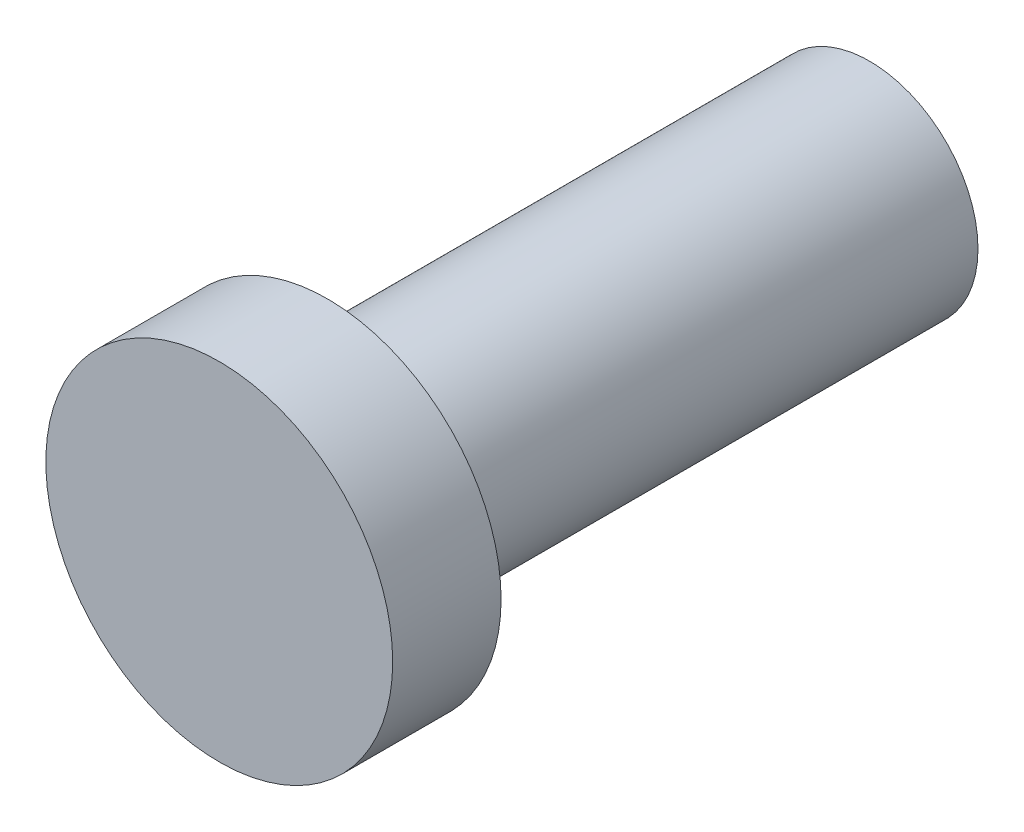
ISO-10303-21;
HEADER;
FILE_DESCRIPTION(('STEP AP214'),'2;1');
FILE_NAME('part.step','',(''),(''),'','','');
FILE_SCHEMA(('AUTOMOTIVE_DESIGN { 1 0 10303 214 1 1 1 1 }'));
ENDSEC;
DATA;
#1=APPLICATION_CONTEXT('core data for automotive mechanical design processes');
#2=APPLICATION_PROTOCOL_DEFINITION('international standard','automotive_design',2000,#1);
#3=PRODUCT_CONTEXT('',#1,'mechanical');
#4=PRODUCT('Part','Part','',(#3));
#5=PRODUCT_RELATED_PRODUCT_CATEGORY('part','',(#4));
#6=PRODUCT_DEFINITION_FORMATION('','',#4);
#7=PRODUCT_DEFINITION_CONTEXT('part definition',#1,'design');
#8=PRODUCT_DEFINITION('design','',#6,#7);
#9=PRODUCT_DEFINITION_SHAPE('','',#8);
#10=(LENGTH_UNIT() NAMED_UNIT(*) SI_UNIT(.MILLI.,.METRE.));
#11=(NAMED_UNIT(*) PLANE_ANGLE_UNIT() SI_UNIT($,.RADIAN.));
#12=(NAMED_UNIT(*) SI_UNIT($,.STERADIAN.) SOLID_ANGLE_UNIT());
#13=UNCERTAINTY_MEASURE_WITH_UNIT(LENGTH_MEASURE(1.E-05),#10,'distance_accuracy_value','');
#14=(GEOMETRIC_REPRESENTATION_CONTEXT(3) GLOBAL_UNCERTAINTY_ASSIGNED_CONTEXT((#13)) GLOBAL_UNIT_ASSIGNED_CONTEXT((#10,
#11,#12)) REPRESENTATION_CONTEXT('',''));
#15=CARTESIAN_POINT('',(0.,0.,0.));
#16=DIRECTION('',(0.,0.,1.));
#17=DIRECTION('',(1.,0.,0.));
#18=AXIS2_PLACEMENT_3D('',#15,#16,#17);
#19=CARTESIAN_POINT('',(0.,0.,25.));
#20=DIRECTION('',(0.,0.,-1.));
#21=DIRECTION('',(-1.,0.,0.));
#22=AXIS2_PLACEMENT_3D('',#19,#20,#21);
#23=CYLINDRICAL_SURFACE('',#22,5.);
#24=CARTESIAN_POINT('',(0.,0.,25.));
#25=DIRECTION('',(0.,0.,1.));
#26=DIRECTION('',(1.,0.,0.));
#27=AXIS2_PLACEMENT_3D('',#24,#25,#26);
#28=CIRCLE('',#27,5.);
#29=CARTESIAN_POINT('',(5.,0.,25.));
#30=VERTEX_POINT('',#29);
#31=EDGE_CURVE('E10',#30,#30,#28,.T.);
#32=ORIENTED_EDGE('',*,*,#31,.F.);
#33=EDGE_LOOP('',(#32));
#34=FACE_BOUND('',#33,.T.);
#35=CARTESIAN_POINT('',(0.,0.,0.));
#36=DIRECTION('',(0.,0.,1.));
#37=DIRECTION('',(1.,0.,0.));
#38=AXIS2_PLACEMENT_3D('',#35,#36,#37);
#39=CIRCLE('',#38,5.);
#40=CARTESIAN_POINT('',(5.,0.,0.));
#41=VERTEX_POINT('',#40);
#42=EDGE_CURVE('E40',#41,#41,#39,.T.);
#43=ORIENTED_EDGE('',*,*,#42,.T.);
#44=EDGE_LOOP('',(#43));
#45=FACE_BOUND('',#44,.T.);
#46=ADVANCED_FACE('F37',(#34,#45),#23,.T.);
#47=CARTESIAN_POINT('',(0.,0.,0.));
#48=DIRECTION('',(0.,0.,1.));
#49=DIRECTION('',(1.,0.,0.));
#50=AXIS2_PLACEMENT_3D('',#47,#48,#49);
#51=PLANE('',#50);
#52=ORIENTED_EDGE('',*,*,#42,.F.);
#53=EDGE_LOOP('',(#52));
#54=FACE_BOUND('',#53,.T.);
#55=ADVANCED_FACE('F60',(#54),#51,.F.);
#56=CARTESIAN_POINT('',(0.,0.,30.));
#57=DIRECTION('',(0.,0.,-1.));
#58=DIRECTION('',(-1.,0.,0.));
#59=AXIS2_PLACEMENT_3D('',#56,#57,#58);
#60=CYLINDRICAL_SURFACE('',#59,8.);
#61=CARTESIAN_POINT('',(0.,0.,30.));
#62=DIRECTION('',(0.,0.,1.));
#63=DIRECTION('',(1.,0.,0.));
#64=AXIS2_PLACEMENT_3D('',#61,#62,#63);
#65=CIRCLE('',#64,8.);
#66=CARTESIAN_POINT('',(8.,0.,30.));
#67=VERTEX_POINT('',#66);
#68=EDGE_CURVE('E47',#67,#67,#65,.T.);
#69=ORIENTED_EDGE('',*,*,#68,.F.);
#70=EDGE_LOOP('',(#69));
#71=FACE_BOUND('',#70,.T.);
#72=CARTESIAN_POINT('',(0.,0.,25.));
#73=DIRECTION('',(0.,0.,1.));
#74=DIRECTION('',(1.,0.,0.));
#75=AXIS2_PLACEMENT_3D('',#72,#73,#74);
#76=CIRCLE('',#75,8.);
#77=CARTESIAN_POINT('',(8.,0.,25.));
#78=VERTEX_POINT('',#77);
#79=EDGE_CURVE('E49',#78,#78,#76,.T.);
#80=ORIENTED_EDGE('',*,*,#79,.T.);
#81=EDGE_LOOP('',(#80));
#82=FACE_BOUND('',#81,.T.);
#83=ADVANCED_FACE('F57',(#71,#82),#60,.T.);
#84=CARTESIAN_POINT('',(0.,0.,30.));
#85=DIRECTION('',(0.,0.,1.));
#86=DIRECTION('',(1.,0.,0.));
#87=AXIS2_PLACEMENT_3D('',#84,#85,#86);
#88=PLANE('',#87);
#89=ORIENTED_EDGE('',*,*,#68,.T.);
#90=EDGE_LOOP('',(#89));
#91=FACE_BOUND('',#90,.T.);
#92=ADVANCED_FACE('F55',(#91),#88,.T.);
#93=CARTESIAN_POINT('',(0.,0.,25.));
#94=DIRECTION('',(0.,0.,1.));
#95=DIRECTION('',(1.,0.,0.));
#96=AXIS2_PLACEMENT_3D('',#93,#94,#95);
#97=PLANE('',#96);
#98=ORIENTED_EDGE('',*,*,#31,.T.);
#99=EDGE_LOOP('',(#98));
#100=FACE_BOUND('',#99,.T.);
#101=ORIENTED_EDGE('',*,*,#79,.F.);
#102=EDGE_LOOP('',(#101));
#103=FACE_BOUND('',#102,.T.);
#104=ADVANCED_FACE('F64',(#100,#103),#97,.F.);
#105=CLOSED_SHELL('',(#46,#55,#83,#92,#104));
#106=MANIFOLD_SOLID_BREP('B2',#105);
#107=ADVANCED_BREP_SHAPE_REPRESENTATION('',(#18,#106),#14);
#108=SHAPE_DEFINITION_REPRESENTATION(#9,#107);
ENDSEC;
END-ISO-10303-21;
